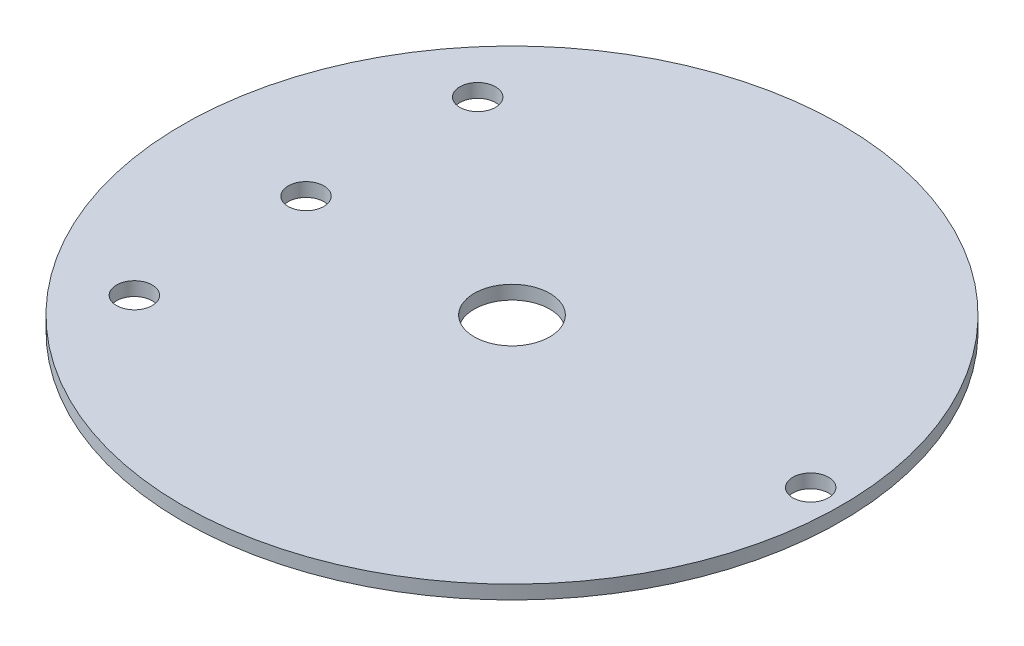
ISO-10303-21;
HEADER;
FILE_DESCRIPTION(('STEP AP214'),'2;1');
FILE_NAME('part.step','',(''),(''),'','','');
FILE_SCHEMA(('AUTOMOTIVE_DESIGN { 1 0 10303 214 1 1 1 1 }'));
ENDSEC;
DATA;
#1=APPLICATION_CONTEXT('core data for automotive mechanical design processes');
#2=APPLICATION_PROTOCOL_DEFINITION('international standard','automotive_design',2000,#1);
#3=PRODUCT_CONTEXT('',#1,'mechanical');
#4=PRODUCT('Part','Part','',(#3));
#5=PRODUCT_RELATED_PRODUCT_CATEGORY('part','',(#4));
#6=PRODUCT_DEFINITION_FORMATION('','',#4);
#7=PRODUCT_DEFINITION_CONTEXT('part definition',#1,'design');
#8=PRODUCT_DEFINITION('design','',#6,#7);
#9=PRODUCT_DEFINITION_SHAPE('','',#8);
#10=(LENGTH_UNIT() NAMED_UNIT(*) SI_UNIT(.MILLI.,.METRE.));
#11=(NAMED_UNIT(*) PLANE_ANGLE_UNIT() SI_UNIT($,.RADIAN.));
#12=(NAMED_UNIT(*) SI_UNIT($,.STERADIAN.) SOLID_ANGLE_UNIT());
#13=UNCERTAINTY_MEASURE_WITH_UNIT(LENGTH_MEASURE(1.E-05),#10,'distance_accuracy_value','');
#14=(GEOMETRIC_REPRESENTATION_CONTEXT(3) GLOBAL_UNCERTAINTY_ASSIGNED_CONTEXT((#13)) GLOBAL_UNIT_ASSIGNED_CONTEXT((#10,
#11,#12)) REPRESENTATION_CONTEXT('',''));
#15=CARTESIAN_POINT('',(0.,0.,0.));
#16=DIRECTION('',(0.,0.,1.));
#17=DIRECTION('',(1.,0.,0.));
#18=AXIS2_PLACEMENT_3D('',#15,#16,#17);
#19=CARTESIAN_POINT('',(0.,2.,0.));
#20=DIRECTION('',(0.,1.,0.));
#21=DIRECTION('',(0.,0.,1.));
#22=AXIS2_PLACEMENT_3D('',#19,#20,#21);
#23=PLANE('',#22);
#24=CARTESIAN_POINT('',(-30.,2.,25.));
#25=DIRECTION('',(0.,1.,0.));
#26=DIRECTION('',(0.,0.,1.));
#27=AXIS2_PLACEMENT_3D('',#24,#25,#26);
#28=CIRCLE('',#27,2.6);
#29=CARTESIAN_POINT('',(-30.,2.,27.6));
#30=VERTEX_POINT('',#29);
#31=EDGE_CURVE('E62',#30,#30,#28,.T.);
#32=ORIENTED_EDGE('',*,*,#31,.F.);
#33=EDGE_LOOP('',(#32));
#34=FACE_BOUND('',#33,.T.);
#35=CARTESIAN_POINT('',(-30.,2.,-25.));
#36=DIRECTION('',(0.,1.,0.));
#37=DIRECTION('',(0.,0.,1.));
#38=AXIS2_PLACEMENT_3D('',#35,#36,#37);
#39=CIRCLE('',#38,2.6);
#40=CARTESIAN_POINT('',(-30.,2.,-22.4));
#41=VERTEX_POINT('',#40);
#42=EDGE_CURVE('E50',#41,#41,#39,.T.);
#43=ORIENTED_EDGE('',*,*,#42,.F.);
#44=EDGE_LOOP('',(#43));
#45=FACE_BOUND('',#44,.T.);
#46=CARTESIAN_POINT('',(0.,2.,0.));
#47=DIRECTION('',(0.,1.,0.));
#48=DIRECTION('',(0.,0.,1.));
#49=AXIS2_PLACEMENT_3D('',#46,#47,#48);
#50=CIRCLE('',#49,48.);
#51=CARTESIAN_POINT('',(0.,2.,48.));
#52=VERTEX_POINT('',#51);
#53=EDGE_CURVE('E10',#52,#52,#50,.T.);
#54=ORIENTED_EDGE('',*,*,#53,.T.);
#55=EDGE_LOOP('',(#54));
#56=FACE_BOUND('',#55,.T.);
#57=CARTESIAN_POINT('',(-30.,2.,0.));
#58=DIRECTION('',(0.,1.,0.));
#59=DIRECTION('',(0.,0.,1.));
#60=AXIS2_PLACEMENT_3D('',#57,#58,#59);
#61=CIRCLE('',#60,2.6);
#62=CARTESIAN_POINT('',(-30.,2.,2.6));
#63=VERTEX_POINT('',#62);
#64=EDGE_CURVE('E45',#63,#63,#61,.T.);
#65=ORIENTED_EDGE('',*,*,#64,.F.);
#66=EDGE_LOOP('',(#65));
#67=FACE_BOUND('',#66,.T.);
#68=CARTESIAN_POINT('',(0.,2.,0.));
#69=DIRECTION('',(0.,1.,0.));
#70=DIRECTION('',(0.,0.,1.));
#71=AXIS2_PLACEMENT_3D('',#68,#69,#70);
#72=CIRCLE('',#71,5.5);
#73=CARTESIAN_POINT('',(0.,2.,5.5));
#74=VERTEX_POINT('',#73);
#75=EDGE_CURVE('E56',#74,#74,#72,.T.);
#76=ORIENTED_EDGE('',*,*,#75,.F.);
#77=EDGE_LOOP('',(#76));
#78=FACE_BOUND('',#77,.T.);
#79=CARTESIAN_POINT('',(43.5,2.,0.));
#80=DIRECTION('',(0.,1.,0.));
#81=DIRECTION('',(0.,0.,1.));
#82=AXIS2_PLACEMENT_3D('',#79,#80,#81);
#83=CIRCLE('',#82,2.6);
#84=CARTESIAN_POINT('',(43.5,2.,2.6));
#85=VERTEX_POINT('',#84);
#86=EDGE_CURVE('E68',#85,#85,#83,.T.);
#87=ORIENTED_EDGE('',*,*,#86,.F.);
#88=EDGE_LOOP('',(#87));
#89=FACE_BOUND('',#88,.T.);
#90=ADVANCED_FACE('F34',(#34,#45,#56,#67,#78,#89),#23,.T.);
#91=CARTESIAN_POINT('',(0.,0.,0.));
#92=DIRECTION('',(0.,1.,0.));
#93=DIRECTION('',(0.,0.,1.));
#94=AXIS2_PLACEMENT_3D('',#91,#92,#93);
#95=PLANE('',#94);
#96=CARTESIAN_POINT('',(0.,0.,0.));
#97=DIRECTION('',(0.,1.,0.));
#98=DIRECTION('',(0.,0.,1.));
#99=AXIS2_PLACEMENT_3D('',#96,#97,#98);
#100=CIRCLE('',#99,48.);
#101=CARTESIAN_POINT('',(0.,0.,48.));
#102=VERTEX_POINT('',#101);
#103=EDGE_CURVE('E38',#102,#102,#100,.T.);
#104=ORIENTED_EDGE('',*,*,#103,.F.);
#105=EDGE_LOOP('',(#104));
#106=FACE_BOUND('',#105,.T.);
#107=CARTESIAN_POINT('',(-30.,0.,0.));
#108=DIRECTION('',(0.,1.,0.));
#109=DIRECTION('',(0.,0.,1.));
#110=AXIS2_PLACEMENT_3D('',#107,#108,#109);
#111=CIRCLE('',#110,2.6);
#112=CARTESIAN_POINT('',(-30.,0.,2.6));
#113=VERTEX_POINT('',#112);
#114=EDGE_CURVE('E47',#113,#113,#111,.T.);
#115=ORIENTED_EDGE('',*,*,#114,.T.);
#116=EDGE_LOOP('',(#115));
#117=FACE_BOUND('',#116,.T.);
#118=CARTESIAN_POINT('',(-30.,0.,-25.));
#119=DIRECTION('',(0.,1.,0.));
#120=DIRECTION('',(0.,0.,1.));
#121=AXIS2_PLACEMENT_3D('',#118,#119,#120);
#122=CIRCLE('',#121,2.6);
#123=CARTESIAN_POINT('',(-30.,0.,-22.4));
#124=VERTEX_POINT('',#123);
#125=EDGE_CURVE('E53',#124,#124,#122,.T.);
#126=ORIENTED_EDGE('',*,*,#125,.T.);
#127=EDGE_LOOP('',(#126));
#128=FACE_BOUND('',#127,.T.);
#129=CARTESIAN_POINT('',(0.,0.,0.));
#130=DIRECTION('',(0.,1.,0.));
#131=DIRECTION('',(0.,0.,1.));
#132=AXIS2_PLACEMENT_3D('',#129,#130,#131);
#133=CIRCLE('',#132,5.5);
#134=CARTESIAN_POINT('',(0.,0.,5.5));
#135=VERTEX_POINT('',#134);
#136=EDGE_CURVE('E59',#135,#135,#133,.T.);
#137=ORIENTED_EDGE('',*,*,#136,.T.);
#138=EDGE_LOOP('',(#137));
#139=FACE_BOUND('',#138,.T.);
#140=CARTESIAN_POINT('',(-30.,0.,25.));
#141=DIRECTION('',(0.,1.,0.));
#142=DIRECTION('',(0.,0.,1.));
#143=AXIS2_PLACEMENT_3D('',#140,#141,#142);
#144=CIRCLE('',#143,2.6);
#145=CARTESIAN_POINT('',(-30.,0.,27.6));
#146=VERTEX_POINT('',#145);
#147=EDGE_CURVE('E65',#146,#146,#144,.T.);
#148=ORIENTED_EDGE('',*,*,#147,.T.);
#149=EDGE_LOOP('',(#148));
#150=FACE_BOUND('',#149,.T.);
#151=CARTESIAN_POINT('',(43.5,0.,0.));
#152=DIRECTION('',(0.,1.,0.));
#153=DIRECTION('',(0.,0.,1.));
#154=AXIS2_PLACEMENT_3D('',#151,#152,#153);
#155=CIRCLE('',#154,2.6);
#156=CARTESIAN_POINT('',(43.5,0.,2.6));
#157=VERTEX_POINT('',#156);
#158=EDGE_CURVE('E71',#157,#157,#155,.T.);
#159=ORIENTED_EDGE('',*,*,#158,.T.);
#160=EDGE_LOOP('',(#159));
#161=FACE_BOUND('',#160,.T.);
#162=ADVANCED_FACE('F81',(#106,#117,#128,#139,#150,#161),#95,.F.);
#163=CARTESIAN_POINT('',(0.,2.,0.));
#164=DIRECTION('',(0.,-1.,0.));
#165=DIRECTION('',(0.,0.,-1.));
#166=AXIS2_PLACEMENT_3D('',#163,#164,#165);
#167=CYLINDRICAL_SURFACE('',#166,48.);
#168=ORIENTED_EDGE('',*,*,#53,.F.);
#169=EDGE_LOOP('',(#168));
#170=FACE_BOUND('',#169,.T.);
#171=ORIENTED_EDGE('',*,*,#103,.T.);
#172=EDGE_LOOP('',(#171));
#173=FACE_BOUND('',#172,.T.);
#174=ADVANCED_FACE('F36',(#170,#173),#167,.T.);
#175=CARTESIAN_POINT('',(-30.,2.,0.));
#176=DIRECTION('',(0.,-1.,0.));
#177=DIRECTION('',(0.,0.,-1.));
#178=AXIS2_PLACEMENT_3D('',#175,#176,#177);
#179=CYLINDRICAL_SURFACE('',#178,2.6);
#180=ORIENTED_EDGE('',*,*,#64,.T.);
#181=EDGE_LOOP('',(#180));
#182=FACE_BOUND('',#181,.T.);
#183=ORIENTED_EDGE('',*,*,#114,.F.);
#184=EDGE_LOOP('',(#183));
#185=FACE_BOUND('',#184,.T.);
#186=ADVANCED_FACE('F91',(#182,#185),#179,.F.);
#187=CARTESIAN_POINT('',(-30.,2.,-25.));
#188=DIRECTION('',(0.,-1.,0.));
#189=DIRECTION('',(0.,0.,-1.));
#190=AXIS2_PLACEMENT_3D('',#187,#188,#189);
#191=CYLINDRICAL_SURFACE('',#190,2.6);
#192=ORIENTED_EDGE('',*,*,#42,.T.);
#193=EDGE_LOOP('',(#192));
#194=FACE_BOUND('',#193,.T.);
#195=ORIENTED_EDGE('',*,*,#125,.F.);
#196=EDGE_LOOP('',(#195));
#197=FACE_BOUND('',#196,.T.);
#198=ADVANCED_FACE('F94',(#194,#197),#191,.F.);
#199=CARTESIAN_POINT('',(0.,2.,0.));
#200=DIRECTION('',(0.,-1.,0.));
#201=DIRECTION('',(0.,0.,-1.));
#202=AXIS2_PLACEMENT_3D('',#199,#200,#201);
#203=CYLINDRICAL_SURFACE('',#202,5.5);
#204=ORIENTED_EDGE('',*,*,#75,.T.);
#205=EDGE_LOOP('',(#204));
#206=FACE_BOUND('',#205,.T.);
#207=ORIENTED_EDGE('',*,*,#136,.F.);
#208=EDGE_LOOP('',(#207));
#209=FACE_BOUND('',#208,.T.);
#210=ADVANCED_FACE('F98',(#206,#209),#203,.F.);
#211=CARTESIAN_POINT('',(-30.,2.,25.));
#212=DIRECTION('',(0.,-1.,0.));
#213=DIRECTION('',(0.,0.,-1.));
#214=AXIS2_PLACEMENT_3D('',#211,#212,#213);
#215=CYLINDRICAL_SURFACE('',#214,2.6);
#216=ORIENTED_EDGE('',*,*,#31,.T.);
#217=EDGE_LOOP('',(#216));
#218=FACE_BOUND('',#217,.T.);
#219=ORIENTED_EDGE('',*,*,#147,.F.);
#220=EDGE_LOOP('',(#219));
#221=FACE_BOUND('',#220,.T.);
#222=ADVANCED_FACE('F102',(#218,#221),#215,.F.);
#223=CARTESIAN_POINT('',(43.5,2.,0.));
#224=DIRECTION('',(0.,-1.,0.));
#225=DIRECTION('',(0.,0.,-1.));
#226=AXIS2_PLACEMENT_3D('',#223,#224,#225);
#227=CYLINDRICAL_SURFACE('',#226,2.6);
#228=ORIENTED_EDGE('',*,*,#86,.T.);
#229=EDGE_LOOP('',(#228));
#230=FACE_BOUND('',#229,.T.);
#231=ORIENTED_EDGE('',*,*,#158,.F.);
#232=EDGE_LOOP('',(#231));
#233=FACE_BOUND('',#232,.T.);
#234=ADVANCED_FACE('F77',(#230,#233),#227,.F.);
#235=CLOSED_SHELL('',(#90,#162,#174,#186,#198,#210,#222,#234));
#236=MANIFOLD_SOLID_BREP('B2',#235);
#237=ADVANCED_BREP_SHAPE_REPRESENTATION('',(#18,#236),#14);
#238=SHAPE_DEFINITION_REPRESENTATION(#9,#237);
ENDSEC;
END-ISO-10303-21;
